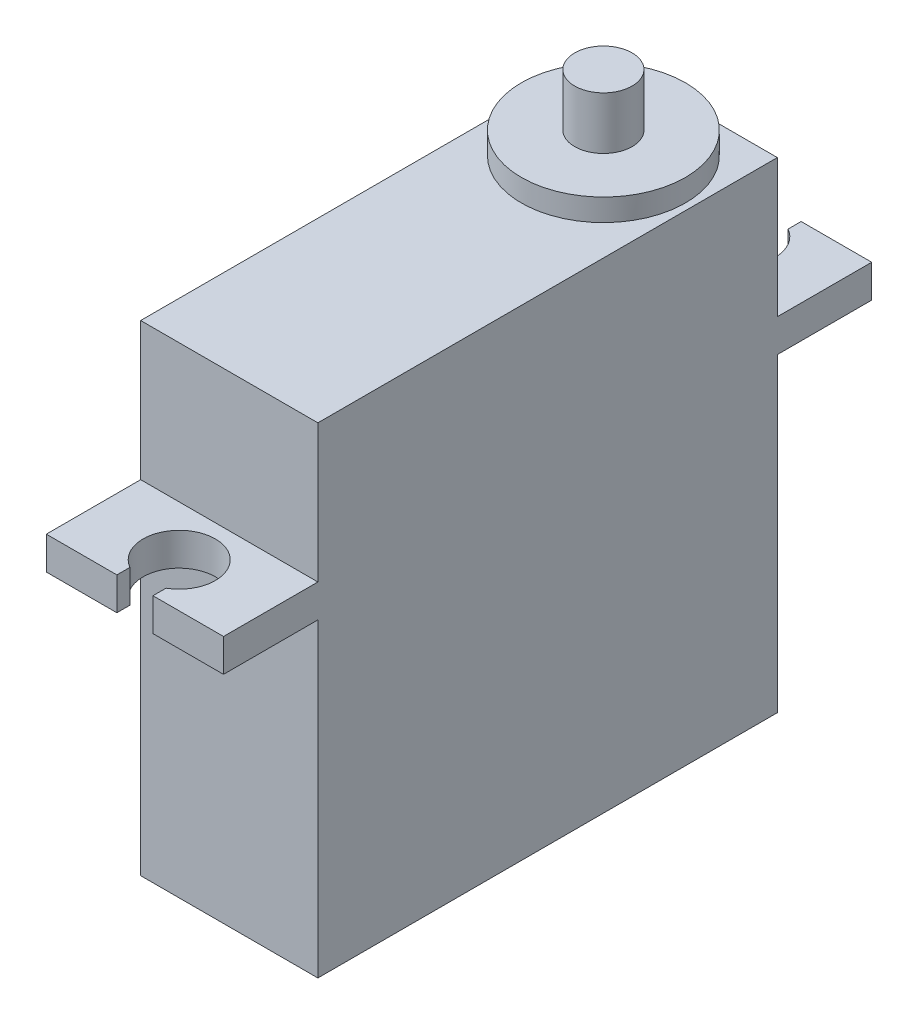
ISO-10303-21;
HEADER;
FILE_DESCRIPTION(('STEP AP214'),'2;1');
FILE_NAME('part.step','',(''),(''),'','','');
FILE_SCHEMA(('AUTOMOTIVE_DESIGN { 1 0 10303 214 1 1 1 1 }'));
ENDSEC;
DATA;
#1=APPLICATION_CONTEXT('core data for automotive mechanical design processes');
#2=APPLICATION_PROTOCOL_DEFINITION('international standard','automotive_design',2000,#1);
#3=PRODUCT_CONTEXT('',#1,'mechanical');
#4=PRODUCT('Part','Part','',(#3));
#5=PRODUCT_RELATED_PRODUCT_CATEGORY('part','',(#4));
#6=PRODUCT_DEFINITION_FORMATION('','',#4);
#7=PRODUCT_DEFINITION_CONTEXT('part definition',#1,'design');
#8=PRODUCT_DEFINITION('design','',#6,#7);
#9=PRODUCT_DEFINITION_SHAPE('','',#8);
#10=(LENGTH_UNIT() NAMED_UNIT(*) SI_UNIT(.MILLI.,.METRE.));
#11=(NAMED_UNIT(*) PLANE_ANGLE_UNIT() SI_UNIT($,.RADIAN.));
#12=(NAMED_UNIT(*) SI_UNIT($,.STERADIAN.) SOLID_ANGLE_UNIT());
#13=UNCERTAINTY_MEASURE_WITH_UNIT(LENGTH_MEASURE(1.E-05),#10,'distance_accuracy_value','');
#14=(GEOMETRIC_REPRESENTATION_CONTEXT(3) GLOBAL_UNCERTAINTY_ASSIGNED_CONTEXT((#13)) GLOBAL_UNIT_ASSIGNED_CONTEXT((#10,
#11,#12)) REPRESENTATION_CONTEXT('',''));
#15=CARTESIAN_POINT('',(0.,0.,0.));
#16=DIRECTION('',(0.,0.,1.));
#17=DIRECTION('',(1.,0.,0.));
#18=AXIS2_PLACEMENT_3D('',#15,#16,#17);
#19=CARTESIAN_POINT('',(5.4,30.65,-22.8));
#20=DIRECTION('',(0.,1.,0.));
#21=DIRECTION('',(0.,0.,1.));
#22=AXIS2_PLACEMENT_3D('',#19,#20,#21);
#23=PLANE('',#22);
#24=CARTESIAN_POINT('',(5.4,30.65,-22.8));
#25=DIRECTION('',(0.,1.,0.));
#26=DIRECTION('',(0.,0.,1.));
#27=AXIS2_PLACEMENT_3D('',#24,#25,#26);
#28=CIRCLE('',#27,5.);
#29=CARTESIAN_POINT('',(5.4,30.65,-17.8));
#30=VERTEX_POINT('',#29);
#31=EDGE_CURVE('E209',#30,#30,#28,.T.);
#32=ORIENTED_EDGE('',*,*,#31,.T.);
#33=EDGE_LOOP('',(#32));
#34=FACE_BOUND('',#33,.T.);
#35=CARTESIAN_POINT('',(5.4,30.65,-22.8));
#36=DIRECTION('',(0.,1.,0.));
#37=DIRECTION('',(0.,0.,1.));
#38=AXIS2_PLACEMENT_3D('',#35,#36,#37);
#39=CIRCLE('',#38,1.75);
#40=CARTESIAN_POINT('',(5.4,30.65,-21.05));
#41=VERTEX_POINT('',#40);
#42=EDGE_CURVE('E650',#41,#41,#39,.T.);
#43=ORIENTED_EDGE('',*,*,#42,.F.);
#44=EDGE_LOOP('',(#43));
#45=FACE_BOUND('',#44,.T.);
#46=ADVANCED_FACE('F32',(#34,#45),#23,.T.);
#47=CARTESIAN_POINT('',(0.,29.3,0.));
#48=DIRECTION('',(0.,-1.,0.));
#49=DIRECTION('',(0.,0.,-1.));
#50=AXIS2_PLACEMENT_3D('',#47,#48,#49);
#51=PLANE('',#50);
#52=DIRECTION('',(0.,0.,1.));
#53=VECTOR('',#52,1.);
#54=CARTESIAN_POINT('',(0.,29.3,0.));
#55=LINE('',#54,#53);
#56=CARTESIAN_POINT('',(0.,29.3,-28.));
#57=VERTEX_POINT('',#56);
#58=CARTESIAN_POINT('',(0.,29.3,0.));
#59=VERTEX_POINT('',#58);
#60=EDGE_CURVE('E296',#57,#59,#55,.T.);
#61=ORIENTED_EDGE('',*,*,#60,.T.);
#62=DIRECTION('',(1.,0.,0.));
#63=VECTOR('',#62,1.);
#64=CARTESIAN_POINT('',(0.,29.3,0.));
#65=LINE('',#64,#63);
#66=CARTESIAN_POINT('',(10.8,29.3,0.));
#67=VERTEX_POINT('',#66);
#68=EDGE_CURVE('E299',#59,#67,#65,.T.);
#69=ORIENTED_EDGE('',*,*,#68,.T.);
#70=DIRECTION('',(0.,0.,-1.));
#71=VECTOR('',#70,1.);
#72=CARTESIAN_POINT('',(10.8,29.3,0.));
#73=LINE('',#72,#71);
#74=CARTESIAN_POINT('',(10.8,29.3,-28.));
#75=VERTEX_POINT('',#74);
#76=EDGE_CURVE('E302',#67,#75,#73,.T.);
#77=ORIENTED_EDGE('',*,*,#76,.T.);
#78=DIRECTION('',(-1.,0.,0.));
#79=VECTOR('',#78,1.);
#80=CARTESIAN_POINT('',(0.,29.3,-28.));
#81=LINE('',#80,#79);
#82=EDGE_CURVE('E304',#75,#57,#81,.T.);
#83=ORIENTED_EDGE('',*,*,#82,.T.);
#84=EDGE_LOOP('',(#61,#69,#77,#83));
#85=FACE_BOUND('',#84,.T.);
#86=CARTESIAN_POINT('',(5.4,29.3,-22.8));
#87=DIRECTION('',(0.,-1.,0.));
#88=DIRECTION('',(0.,0.,-1.));
#89=AXIS2_PLACEMENT_3D('',#86,#87,#88);
#90=CIRCLE('',#89,5.);
#91=CARTESIAN_POINT('',(5.4,29.3,-27.8));
#92=VERTEX_POINT('',#91);
#93=EDGE_CURVE('E11',#92,#92,#90,.F.);
#94=ORIENTED_EDGE('',*,*,#93,.F.);
#95=EDGE_LOOP('',(#94));
#96=FACE_BOUND('',#95,.T.);
#97=ADVANCED_FACE('F384',(#85,#96),#51,.F.);
#98=CARTESIAN_POINT('',(0.,29.3,0.));
#99=DIRECTION('',(0.,0.,-1.));
#100=DIRECTION('',(-1.,0.,0.));
#101=AXIS2_PLACEMENT_3D('',#98,#99,#100);
#102=PLANE('',#101);
#103=DIRECTION('',(-1.,0.,0.));
#104=VECTOR('',#103,1.);
#105=CARTESIAN_POINT('',(0.,20.9,0.));
#106=LINE('',#105,#104);
#107=CARTESIAN_POINT('',(10.8,20.9,0.));
#108=VERTEX_POINT('',#107);
#109=CARTESIAN_POINT('',(0.,20.9,0.));
#110=VERTEX_POINT('',#109);
#111=EDGE_CURVE('E204',#108,#110,#106,.T.);
#112=ORIENTED_EDGE('',*,*,#111,.F.);
#113=DIRECTION('',(0.,-1.,0.));
#114=VECTOR('',#113,1.);
#115=CARTESIAN_POINT('',(10.8,29.3,0.));
#116=LINE('',#115,#114);
#117=EDGE_CURVE('E333',#67,#108,#116,.T.);
#118=ORIENTED_EDGE('',*,*,#117,.F.);
#119=ORIENTED_EDGE('',*,*,#68,.F.);
#120=DIRECTION('',(0.,-1.,0.));
#121=VECTOR('',#120,1.);
#122=CARTESIAN_POINT('',(0.,29.3,0.));
#123=LINE('',#122,#121);
#124=EDGE_CURVE('E40',#59,#110,#123,.T.);
#125=ORIENTED_EDGE('',*,*,#124,.T.);
#126=EDGE_LOOP('',(#112,#118,#119,#125));
#127=FACE_BOUND('',#126,.T.);
#128=ADVANCED_FACE('F390',(#127),#102,.F.);
#129=CARTESIAN_POINT('',(0.,29.3,-28.));
#130=DIRECTION('',(0.,0.,1.));
#131=DIRECTION('',(1.,0.,0.));
#132=AXIS2_PLACEMENT_3D('',#129,#130,#131);
#133=PLANE('',#132);
#134=DIRECTION('',(1.,0.,0.));
#135=VECTOR('',#134,1.);
#136=CARTESIAN_POINT('',(0.,20.9,-28.));
#137=LINE('',#136,#135);
#138=CARTESIAN_POINT('',(0.,20.9,-28.));
#139=VERTEX_POINT('',#138);
#140=CARTESIAN_POINT('',(10.8,20.9,-28.));
#141=VERTEX_POINT('',#140);
#142=EDGE_CURVE('E258',#139,#141,#137,.T.);
#143=ORIENTED_EDGE('',*,*,#142,.F.);
#144=DIRECTION('',(0.,-1.,0.));
#145=VECTOR('',#144,1.);
#146=CARTESIAN_POINT('',(0.,29.3,-28.));
#147=LINE('',#146,#145);
#148=EDGE_CURVE('E322',#57,#139,#147,.T.);
#149=ORIENTED_EDGE('',*,*,#148,.F.);
#150=ORIENTED_EDGE('',*,*,#82,.F.);
#151=DIRECTION('',(0.,-1.,0.));
#152=VECTOR('',#151,1.);
#153=CARTESIAN_POINT('',(10.8,29.3,-28.));
#154=LINE('',#153,#152);
#155=EDGE_CURVE('E334',#75,#141,#154,.T.);
#156=ORIENTED_EDGE('',*,*,#155,.T.);
#157=EDGE_LOOP('',(#143,#149,#150,#156));
#158=FACE_BOUND('',#157,.T.);
#159=ADVANCED_FACE('F380',(#158),#133,.F.);
#160=CARTESIAN_POINT('',(0.,29.3,0.));
#161=DIRECTION('',(1.,0.,0.));
#162=DIRECTION('',(0.,0.,-1.));
#163=AXIS2_PLACEMENT_3D('',#160,#161,#162);
#164=PLANE('',#163);
#165=DIRECTION('',(0.,0.,1.));
#166=VECTOR('',#165,1.);
#167=CARTESIAN_POINT('',(0.,0.,0.));
#168=LINE('',#167,#166);
#169=CARTESIAN_POINT('',(0.,0.,-28.));
#170=VERTEX_POINT('',#169);
#171=CARTESIAN_POINT('',(0.,0.,0.));
#172=VERTEX_POINT('',#171);
#173=EDGE_CURVE('E285',#170,#172,#168,.T.);
#174=ORIENTED_EDGE('',*,*,#173,.T.);
#175=CARTESIAN_POINT('',(0.,18.9,0.));
#176=VERTEX_POINT('',#175);
#177=EDGE_CURVE('E189',#176,#172,#123,.T.);
#178=ORIENTED_EDGE('',*,*,#177,.F.);
#179=DIRECTION('',(0.,0.,1.));
#180=VECTOR('',#179,1.);
#181=CARTESIAN_POINT('',(0.,18.9,0.));
#182=LINE('',#181,#180);
#183=CARTESIAN_POINT('',(0.,18.9,5.74999999999999));
#184=VERTEX_POINT('',#183);
#185=EDGE_CURVE('E47',#176,#184,#182,.T.);
#186=ORIENTED_EDGE('',*,*,#185,.T.);
#187=DIRECTION('',(0.,1.,0.));
#188=VECTOR('',#187,1.);
#189=CARTESIAN_POINT('',(0.,18.9,5.74999999999999));
#190=LINE('',#189,#188);
#191=CARTESIAN_POINT('',(0.,20.9,5.74999999999999));
#192=VERTEX_POINT('',#191);
#193=EDGE_CURVE('E171',#184,#192,#190,.T.);
#194=ORIENTED_EDGE('',*,*,#193,.T.);
#195=DIRECTION('',(0.,0.,1.));
#196=VECTOR('',#195,1.);
#197=CARTESIAN_POINT('',(0.,20.9,0.));
#198=LINE('',#197,#196);
#199=EDGE_CURVE('E208',#110,#192,#198,.T.);
#200=ORIENTED_EDGE('',*,*,#199,.F.);
#201=ORIENTED_EDGE('',*,*,#124,.F.);
#202=ORIENTED_EDGE('',*,*,#60,.F.);
#203=ORIENTED_EDGE('',*,*,#148,.T.);
#204=DIRECTION('',(0.,0.,1.));
#205=VECTOR('',#204,1.);
#206=CARTESIAN_POINT('',(0.,20.9,-28.));
#207=LINE('',#206,#205);
#208=CARTESIAN_POINT('',(0.,20.9,-33.75));
#209=VERTEX_POINT('',#208);
#210=EDGE_CURVE('E230',#209,#139,#207,.T.);
#211=ORIENTED_EDGE('',*,*,#210,.F.);
#212=DIRECTION('',(0.,1.,0.));
#213=VECTOR('',#212,1.);
#214=CARTESIAN_POINT('',(0.,18.9,-33.75));
#215=LINE('',#214,#213);
#216=CARTESIAN_POINT('',(0.,18.9,-33.75));
#217=VERTEX_POINT('',#216);
#218=EDGE_CURVE('E283',#217,#209,#215,.T.);
#219=ORIENTED_EDGE('',*,*,#218,.F.);
#220=DIRECTION('',(0.,0.,1.));
#221=VECTOR('',#220,1.);
#222=CARTESIAN_POINT('',(0.,18.9,-28.));
#223=LINE('',#222,#221);
#224=CARTESIAN_POINT('',(0.,18.9,-28.));
#225=VERTEX_POINT('',#224);
#226=EDGE_CURVE('E246',#217,#225,#223,.T.);
#227=ORIENTED_EDGE('',*,*,#226,.T.);
#228=EDGE_CURVE('E306',#225,#170,#147,.T.);
#229=ORIENTED_EDGE('',*,*,#228,.T.);
#230=EDGE_LOOP('',(#174,#178,#186,#194,#200,#201,#202,#203,#211,#219,#227,#229));
#231=FACE_BOUND('',#230,.T.);
#232=ADVANCED_FACE('F34',(#231),#164,.F.);
#233=CARTESIAN_POINT('',(10.8,18.9,0.));
#234=VERTEX_POINT('',#233);
#235=CARTESIAN_POINT('',(10.8,0.,0.));
#236=VERTEX_POINT('',#235);
#237=EDGE_CURVE('E331',#234,#236,#116,.T.);
#238=ORIENTED_EDGE('',*,*,#237,.F.);
#239=DIRECTION('',(-1.,0.,0.));
#240=VECTOR('',#239,1.);
#241=CARTESIAN_POINT('',(0.,18.9,0.));
#242=LINE('',#241,#240);
#243=EDGE_CURVE('E190',#234,#176,#242,.T.);
#244=ORIENTED_EDGE('',*,*,#243,.T.);
#245=ORIENTED_EDGE('',*,*,#177,.T.);
#246=DIRECTION('',(1.,0.,0.));
#247=VECTOR('',#246,1.);
#248=CARTESIAN_POINT('',(0.,0.,0.));
#249=LINE('',#248,#247);
#250=EDGE_CURVE('E308',#172,#236,#249,.T.);
#251=ORIENTED_EDGE('',*,*,#250,.T.);
#252=EDGE_LOOP('',(#238,#244,#245,#251));
#253=FACE_BOUND('',#252,.T.);
#254=ADVANCED_FACE('F402',(#253),#102,.F.);
#255=CARTESIAN_POINT('',(10.8,29.3,0.));
#256=DIRECTION('',(-1.,0.,0.));
#257=DIRECTION('',(0.,0.,1.));
#258=AXIS2_PLACEMENT_3D('',#255,#256,#257);
#259=PLANE('',#258);
#260=DIRECTION('',(0.,0.,-1.));
#261=VECTOR('',#260,1.);
#262=CARTESIAN_POINT('',(10.8,0.,0.));
#263=LINE('',#262,#261);
#264=CARTESIAN_POINT('',(10.8,0.,-28.));
#265=VERTEX_POINT('',#264);
#266=EDGE_CURVE('E311',#236,#265,#263,.T.);
#267=ORIENTED_EDGE('',*,*,#266,.T.);
#268=CARTESIAN_POINT('',(10.8,18.9,-28.));
#269=VERTEX_POINT('',#268);
#270=EDGE_CURVE('E247',#269,#265,#154,.T.);
#271=ORIENTED_EDGE('',*,*,#270,.F.);
#272=DIRECTION('',(0.,0.,-1.));
#273=VECTOR('',#272,1.);
#274=CARTESIAN_POINT('',(10.8,18.9,-28.));
#275=LINE('',#274,#273);
#276=CARTESIAN_POINT('',(10.8,18.9,-33.75));
#277=VERTEX_POINT('',#276);
#278=EDGE_CURVE('E55',#269,#277,#275,.T.);
#279=ORIENTED_EDGE('',*,*,#278,.T.);
#280=DIRECTION('',(0.,1.,0.));
#281=VECTOR('',#280,1.);
#282=CARTESIAN_POINT('',(10.8,18.9,-33.75));
#283=LINE('',#282,#281);
#284=CARTESIAN_POINT('',(10.8,20.9,-33.75));
#285=VERTEX_POINT('',#284);
#286=EDGE_CURVE('E294',#277,#285,#283,.T.);
#287=ORIENTED_EDGE('',*,*,#286,.T.);
#288=DIRECTION('',(0.,0.,-1.));
#289=VECTOR('',#288,1.);
#290=CARTESIAN_POINT('',(10.8,20.9,-28.));
#291=LINE('',#290,#289);
#292=EDGE_CURVE('E262',#141,#285,#291,.T.);
#293=ORIENTED_EDGE('',*,*,#292,.F.);
#294=ORIENTED_EDGE('',*,*,#155,.F.);
#295=ORIENTED_EDGE('',*,*,#76,.F.);
#296=ORIENTED_EDGE('',*,*,#117,.T.);
#297=DIRECTION('',(0.,0.,-1.));
#298=VECTOR('',#297,1.);
#299=CARTESIAN_POINT('',(10.8,20.9,0.));
#300=LINE('',#299,#298);
#301=CARTESIAN_POINT('',(10.8,20.9,5.75000000000001));
#302=VERTEX_POINT('',#301);
#303=EDGE_CURVE('E192',#302,#108,#300,.T.);
#304=ORIENTED_EDGE('',*,*,#303,.F.);
#305=DIRECTION('',(0.,1.,0.));
#306=VECTOR('',#305,1.);
#307=CARTESIAN_POINT('',(10.8,18.9,5.75000000000001));
#308=LINE('',#307,#306);
#309=CARTESIAN_POINT('',(10.8,18.9,5.75000000000001));
#310=VERTEX_POINT('',#309);
#311=EDGE_CURVE('E228',#310,#302,#308,.T.);
#312=ORIENTED_EDGE('',*,*,#311,.F.);
#313=DIRECTION('',(0.,0.,-1.));
#314=VECTOR('',#313,1.);
#315=CARTESIAN_POINT('',(10.8,18.9,0.));
#316=LINE('',#315,#314);
#317=EDGE_CURVE('E179',#310,#234,#316,.T.);
#318=ORIENTED_EDGE('',*,*,#317,.T.);
#319=ORIENTED_EDGE('',*,*,#237,.T.);
#320=EDGE_LOOP('',(#267,#271,#279,#287,#293,#294,#295,#296,#304,#312,#318,#319));
#321=FACE_BOUND('',#320,.T.);
#322=ADVANCED_FACE('F348',(#321),#259,.F.);
#323=ORIENTED_EDGE('',*,*,#228,.F.);
#324=DIRECTION('',(1.,0.,0.));
#325=VECTOR('',#324,1.);
#326=CARTESIAN_POINT('',(0.,18.9,-28.));
#327=LINE('',#326,#325);
#328=EDGE_CURVE('E243',#225,#269,#327,.T.);
#329=ORIENTED_EDGE('',*,*,#328,.T.);
#330=ORIENTED_EDGE('',*,*,#270,.T.);
#331=DIRECTION('',(-1.,0.,0.));
#332=VECTOR('',#331,1.);
#333=CARTESIAN_POINT('',(0.,0.,-28.));
#334=LINE('',#333,#332);
#335=EDGE_CURVE('E300',#265,#170,#334,.T.);
#336=ORIENTED_EDGE('',*,*,#335,.T.);
#337=EDGE_LOOP('',(#323,#329,#330,#336));
#338=FACE_BOUND('',#337,.T.);
#339=ADVANCED_FACE('F411',(#338),#133,.F.);
#340=CARTESIAN_POINT('',(0.,0.,0.));
#341=DIRECTION('',(0.,-1.,0.));
#342=DIRECTION('',(0.,0.,-1.));
#343=AXIS2_PLACEMENT_3D('',#340,#341,#342);
#344=PLANE('',#343);
#345=ORIENTED_EDGE('',*,*,#173,.F.);
#346=ORIENTED_EDGE('',*,*,#335,.F.);
#347=ORIENTED_EDGE('',*,*,#266,.F.);
#348=ORIENTED_EDGE('',*,*,#250,.F.);
#349=EDGE_LOOP('',(#345,#346,#347,#348));
#350=FACE_BOUND('',#349,.T.);
#351=ADVANCED_FACE('F408',(#350),#344,.T.);
#352=CARTESIAN_POINT('',(0.,18.9,-33.75));
#353=DIRECTION('',(0.,0.,-1.));
#354=DIRECTION('',(-1.,0.,0.));
#355=AXIS2_PLACEMENT_3D('',#352,#353,#354);
#356=PLANE('',#355);
#357=DIRECTION('',(-1.,0.,0.));
#358=VECTOR('',#357,1.);
#359=CARTESIAN_POINT('',(0.,20.9,-33.75));
#360=LINE('',#359,#358);
#361=CARTESIAN_POINT('',(4.3,20.9,-33.75));
#362=VERTEX_POINT('',#361);
#363=EDGE_CURVE('E255',#362,#209,#360,.T.);
#364=ORIENTED_EDGE('',*,*,#363,.F.);
#365=DIRECTION('',(0.,1.,0.));
#366=VECTOR('',#365,1.);
#367=CARTESIAN_POINT('',(4.3,18.9,-33.75));
#368=LINE('',#367,#366);
#369=CARTESIAN_POINT('',(4.3,18.9,-33.75));
#370=VERTEX_POINT('',#369);
#371=EDGE_CURVE('E286',#370,#362,#368,.T.);
#372=ORIENTED_EDGE('',*,*,#371,.F.);
#373=DIRECTION('',(-1.,0.,0.));
#374=VECTOR('',#373,1.);
#375=CARTESIAN_POINT('',(0.,18.9,-33.75));
#376=LINE('',#375,#374);
#377=EDGE_CURVE('E267',#370,#217,#376,.T.);
#378=ORIENTED_EDGE('',*,*,#377,.T.);
#379=ORIENTED_EDGE('',*,*,#218,.T.);
#380=EDGE_LOOP('',(#364,#372,#378,#379));
#381=FACE_BOUND('',#380,.T.);
#382=ADVANCED_FACE('F376',(#381),#356,.T.);
#383=CARTESIAN_POINT('',(4.3,18.9,-33.75));
#384=DIRECTION('',(1.,0.,0.));
#385=DIRECTION('',(0.,0.,-1.));
#386=AXIS2_PLACEMENT_3D('',#383,#384,#385);
#387=PLANE('',#386);
#388=DIRECTION('',(0.,0.,-1.));
#389=VECTOR('',#388,1.);
#390=CARTESIAN_POINT('',(4.3,20.9,-33.75));
#391=LINE('',#390,#389);
#392=CARTESIAN_POINT('',(4.3,20.9,-32.9552558883258));
#393=VERTEX_POINT('',#392);
#394=EDGE_CURVE('E278',#393,#362,#391,.T.);
#395=ORIENTED_EDGE('',*,*,#394,.F.);
#396=DIRECTION('',(0.,1.,0.));
#397=VECTOR('',#396,1.);
#398=CARTESIAN_POINT('',(4.3,18.9,-32.9552558883258));
#399=LINE('',#398,#397);
#400=CARTESIAN_POINT('',(4.3,18.9,-32.9552558883258));
#401=VERTEX_POINT('',#400);
#402=EDGE_CURVE('E288',#401,#393,#399,.T.);
#403=ORIENTED_EDGE('',*,*,#402,.F.);
#404=DIRECTION('',(0.,0.,-1.));
#405=VECTOR('',#404,1.);
#406=CARTESIAN_POINT('',(4.3,18.9,-33.75));
#407=LINE('',#406,#405);
#408=EDGE_CURVE('E372',#401,#370,#407,.T.);
#409=ORIENTED_EDGE('',*,*,#408,.T.);
#410=ORIENTED_EDGE('',*,*,#371,.T.);
#411=EDGE_LOOP('',(#395,#403,#409,#410));
#412=FACE_BOUND('',#411,.T.);
#413=ADVANCED_FACE('F371',(#412),#387,.T.);
#414=CARTESIAN_POINT('',(5.4,18.9,-31.05));
#415=DIRECTION('',(0.,1.,0.));
#416=DIRECTION('',(0.,0.,1.));
#417=AXIS2_PLACEMENT_3D('',#414,#415,#416);
#418=CYLINDRICAL_SURFACE('',#417,2.19999999999999);
#419=CARTESIAN_POINT('',(5.4,20.9,-31.05));
#420=DIRECTION('',(0.,-1.,0.));
#421=DIRECTION('',(0.,0.,1.));
#422=AXIS2_PLACEMENT_3D('',#419,#420,#421);
#423=CIRCLE('',#422,2.19999999999999);
#424=CARTESIAN_POINT('',(6.5,20.9,-32.9552558883258));
#425=VERTEX_POINT('',#424);
#426=EDGE_CURVE('E275',#425,#393,#423,.T.);
#427=ORIENTED_EDGE('',*,*,#426,.F.);
#428=DIRECTION('',(0.,1.,0.));
#429=VECTOR('',#428,1.);
#430=CARTESIAN_POINT('',(6.5,18.9,-32.9552558883258));
#431=LINE('',#430,#429);
#432=CARTESIAN_POINT('',(6.5,18.9,-32.9552558883258));
#433=VERTEX_POINT('',#432);
#434=EDGE_CURVE('E290',#433,#425,#431,.T.);
#435=ORIENTED_EDGE('',*,*,#434,.F.);
#436=CARTESIAN_POINT('',(5.4,18.9,-31.05));
#437=DIRECTION('',(0.,-1.,0.));
#438=DIRECTION('',(0.,0.,1.));
#439=AXIS2_PLACEMENT_3D('',#436,#437,#438);
#440=CIRCLE('',#439,2.19999999999999);
#441=EDGE_CURVE('E367',#433,#401,#440,.T.);
#442=ORIENTED_EDGE('',*,*,#441,.T.);
#443=ORIENTED_EDGE('',*,*,#402,.T.);
#444=EDGE_LOOP('',(#427,#435,#442,#443));
#445=FACE_BOUND('',#444,.T.);
#446=ADVANCED_FACE('F364',(#445),#418,.F.);
#447=CARTESIAN_POINT('',(6.5,18.9,-33.75));
#448=DIRECTION('',(-1.,0.,0.));
#449=DIRECTION('',(0.,0.,1.));
#450=AXIS2_PLACEMENT_3D('',#447,#448,#449);
#451=PLANE('',#450);
#452=DIRECTION('',(0.,0.,1.));
#453=VECTOR('',#452,1.);
#454=CARTESIAN_POINT('',(6.5,20.9,-33.75));
#455=LINE('',#454,#453);
#456=CARTESIAN_POINT('',(6.5,20.9,-33.75));
#457=VERTEX_POINT('',#456);
#458=EDGE_CURVE('E272',#457,#425,#455,.T.);
#459=ORIENTED_EDGE('',*,*,#458,.F.);
#460=DIRECTION('',(0.,1.,0.));
#461=VECTOR('',#460,1.);
#462=CARTESIAN_POINT('',(6.5,18.9,-33.75));
#463=LINE('',#462,#461);
#464=CARTESIAN_POINT('',(6.5,18.9,-33.75));
#465=VERTEX_POINT('',#464);
#466=EDGE_CURVE('E292',#465,#457,#463,.T.);
#467=ORIENTED_EDGE('',*,*,#466,.F.);
#468=DIRECTION('',(0.,0.,1.));
#469=VECTOR('',#468,1.);
#470=CARTESIAN_POINT('',(6.5,18.9,-33.75));
#471=LINE('',#470,#469);
#472=EDGE_CURVE('E414',#465,#433,#471,.T.);
#473=ORIENTED_EDGE('',*,*,#472,.T.);
#474=ORIENTED_EDGE('',*,*,#434,.T.);
#475=EDGE_LOOP('',(#459,#467,#473,#474));
#476=FACE_BOUND('',#475,.T.);
#477=ADVANCED_FACE('F359',(#476),#451,.T.);
#478=CARTESIAN_POINT('',(6.5,18.9,-33.75));
#479=DIRECTION('',(0.,0.,-1.));
#480=DIRECTION('',(-1.,0.,0.));
#481=AXIS2_PLACEMENT_3D('',#478,#479,#480);
#482=PLANE('',#481);
#483=DIRECTION('',(-1.,0.,0.));
#484=VECTOR('',#483,1.);
#485=CARTESIAN_POINT('',(6.5,20.9,-33.75));
#486=LINE('',#485,#484);
#487=EDGE_CURVE('E269',#285,#457,#486,.T.);
#488=ORIENTED_EDGE('',*,*,#487,.F.);
#489=ORIENTED_EDGE('',*,*,#286,.F.);
#490=DIRECTION('',(-1.,0.,0.));
#491=VECTOR('',#490,1.);
#492=CARTESIAN_POINT('',(6.5,18.9,-33.75));
#493=LINE('',#492,#491);
#494=EDGE_CURVE('E240',#277,#465,#493,.T.);
#495=ORIENTED_EDGE('',*,*,#494,.T.);
#496=ORIENTED_EDGE('',*,*,#466,.T.);
#497=EDGE_LOOP('',(#488,#489,#495,#496));
#498=FACE_BOUND('',#497,.T.);
#499=ADVANCED_FACE('F354',(#498),#482,.T.);
#500=CARTESIAN_POINT('',(5.4,18.9,-31.05));
#501=DIRECTION('',(0.,1.,0.));
#502=DIRECTION('',(0.,0.,1.));
#503=AXIS2_PLACEMENT_3D('',#500,#501,#502);
#504=PLANE('',#503);
#505=ORIENTED_EDGE('',*,*,#226,.F.);
#506=ORIENTED_EDGE('',*,*,#377,.F.);
#507=ORIENTED_EDGE('',*,*,#408,.F.);
#508=ORIENTED_EDGE('',*,*,#441,.F.);
#509=ORIENTED_EDGE('',*,*,#472,.F.);
#510=ORIENTED_EDGE('',*,*,#494,.F.);
#511=ORIENTED_EDGE('',*,*,#278,.F.);
#512=ORIENTED_EDGE('',*,*,#328,.F.);
#513=EDGE_LOOP('',(#505,#506,#507,#508,#509,#510,#511,#512));
#514=FACE_BOUND('',#513,.T.);
#515=ADVANCED_FACE('F413',(#514),#504,.F.);
#516=CARTESIAN_POINT('',(5.4,20.9,-31.05));
#517=DIRECTION('',(0.,1.,0.));
#518=DIRECTION('',(0.,0.,1.));
#519=AXIS2_PLACEMENT_3D('',#516,#517,#518);
#520=PLANE('',#519);
#521=ORIENTED_EDGE('',*,*,#210,.T.);
#522=ORIENTED_EDGE('',*,*,#142,.T.);
#523=ORIENTED_EDGE('',*,*,#292,.T.);
#524=ORIENTED_EDGE('',*,*,#487,.T.);
#525=ORIENTED_EDGE('',*,*,#458,.T.);
#526=ORIENTED_EDGE('',*,*,#426,.T.);
#527=ORIENTED_EDGE('',*,*,#394,.T.);
#528=ORIENTED_EDGE('',*,*,#363,.T.);
#529=EDGE_LOOP('',(#521,#522,#523,#524,#525,#526,#527,#528));
#530=FACE_BOUND('',#529,.T.);
#531=ADVANCED_FACE('F342',(#530),#520,.T.);
#532=CARTESIAN_POINT('',(6.5,18.9,5.75));
#533=DIRECTION('',(0.,0.,1.));
#534=DIRECTION('',(1.,0.,0.));
#535=AXIS2_PLACEMENT_3D('',#532,#533,#534);
#536=PLANE('',#535);
#537=DIRECTION('',(1.,0.,0.));
#538=VECTOR('',#537,1.);
#539=CARTESIAN_POINT('',(6.5,20.9,5.75));
#540=LINE('',#539,#538);
#541=CARTESIAN_POINT('',(6.5,20.9,5.75));
#542=VERTEX_POINT('',#541);
#543=EDGE_CURVE('E225',#542,#302,#540,.T.);
#544=ORIENTED_EDGE('',*,*,#543,.F.);
#545=DIRECTION('',(0.,1.,0.));
#546=VECTOR('',#545,1.);
#547=CARTESIAN_POINT('',(6.5,18.9,5.75));
#548=LINE('',#547,#546);
#549=CARTESIAN_POINT('',(6.5,18.9,5.75));
#550=VERTEX_POINT('',#549);
#551=EDGE_CURVE('E231',#550,#542,#548,.T.);
#552=ORIENTED_EDGE('',*,*,#551,.F.);
#553=DIRECTION('',(1.,0.,0.));
#554=VECTOR('',#553,1.);
#555=CARTESIAN_POINT('',(6.5,18.9,5.75));
#556=LINE('',#555,#554);
#557=EDGE_CURVE('E201',#550,#310,#556,.T.);
#558=ORIENTED_EDGE('',*,*,#557,.T.);
#559=ORIENTED_EDGE('',*,*,#311,.T.);
#560=EDGE_LOOP('',(#544,#552,#558,#559));
#561=FACE_BOUND('',#560,.T.);
#562=ADVANCED_FACE('F396',(#561),#536,.T.);
#563=CARTESIAN_POINT('',(6.5,18.9,5.75));
#564=DIRECTION('',(-1.,0.,0.));
#565=DIRECTION('',(0.,0.,1.));
#566=AXIS2_PLACEMENT_3D('',#563,#564,#565);
#567=PLANE('',#566);
#568=DIRECTION('',(0.,0.,1.));
#569=VECTOR('',#568,1.);
#570=CARTESIAN_POINT('',(6.5,20.9,5.75));
#571=LINE('',#570,#569);
#572=CARTESIAN_POINT('',(6.5,20.9,4.95525588832577));
#573=VERTEX_POINT('',#572);
#574=EDGE_CURVE('E222',#573,#542,#571,.T.);
#575=ORIENTED_EDGE('',*,*,#574,.F.);
#576=DIRECTION('',(0.,1.,0.));
#577=VECTOR('',#576,1.);
#578=CARTESIAN_POINT('',(6.5,18.9,4.95525588832577));
#579=LINE('',#578,#577);
#580=CARTESIAN_POINT('',(6.5,18.9,4.95525588832577));
#581=VERTEX_POINT('',#580);
#582=EDGE_CURVE('E233',#581,#573,#579,.T.);
#583=ORIENTED_EDGE('',*,*,#582,.F.);
#584=DIRECTION('',(0.,0.,1.));
#585=VECTOR('',#584,1.);
#586=CARTESIAN_POINT('',(6.5,18.9,5.75));
#587=LINE('',#586,#585);
#588=EDGE_CURVE('E660',#581,#550,#587,.T.);
#589=ORIENTED_EDGE('',*,*,#588,.T.);
#590=ORIENTED_EDGE('',*,*,#551,.T.);
#591=EDGE_LOOP('',(#575,#583,#589,#590));
#592=FACE_BOUND('',#591,.T.);
#593=ADVANCED_FACE('F448',(#592),#567,.T.);
#594=CARTESIAN_POINT('',(5.4,18.9,3.05));
#595=DIRECTION('',(0.,1.,0.));
#596=DIRECTION('',(0.,0.,1.));
#597=AXIS2_PLACEMENT_3D('',#594,#595,#596);
#598=CYLINDRICAL_SURFACE('',#597,2.2);
#599=CARTESIAN_POINT('',(5.4,20.9,3.05));
#600=DIRECTION('',(0.,-1.,0.));
#601=DIRECTION('',(0.,0.,-1.));
#602=AXIS2_PLACEMENT_3D('',#599,#600,#601);
#603=CIRCLE('',#602,2.2);
#604=CARTESIAN_POINT('',(4.30000000000001,20.9,4.95525588832577));
#605=VERTEX_POINT('',#604);
#606=EDGE_CURVE('E219',#605,#573,#603,.T.);
#607=ORIENTED_EDGE('',*,*,#606,.F.);
#608=DIRECTION('',(0.,1.,0.));
#609=VECTOR('',#608,1.);
#610=CARTESIAN_POINT('',(4.30000000000001,18.9,4.95525588832577));
#611=LINE('',#610,#609);
#612=CARTESIAN_POINT('',(4.30000000000001,18.9,4.95525588832577));
#613=VERTEX_POINT('',#612);
#614=EDGE_CURVE('E235',#613,#605,#611,.T.);
#615=ORIENTED_EDGE('',*,*,#614,.F.);
#616=CARTESIAN_POINT('',(5.4,18.9,3.05));
#617=DIRECTION('',(0.,-1.,0.));
#618=DIRECTION('',(0.,0.,-1.));
#619=AXIS2_PLACEMENT_3D('',#616,#617,#618);
#620=CIRCLE('',#619,2.2);
#621=EDGE_CURVE('E658',#613,#581,#620,.T.);
#622=ORIENTED_EDGE('',*,*,#621,.T.);
#623=ORIENTED_EDGE('',*,*,#582,.T.);
#624=EDGE_LOOP('',(#607,#615,#622,#623));
#625=FACE_BOUND('',#624,.T.);
#626=ADVANCED_FACE('F451',(#625),#598,.F.);
#627=CARTESIAN_POINT('',(4.30000000000001,18.9,5.75));
#628=DIRECTION('',(1.,0.,0.));
#629=DIRECTION('',(0.,0.,-1.));
#630=AXIS2_PLACEMENT_3D('',#627,#628,#629);
#631=PLANE('',#630);
#632=DIRECTION('',(0.,0.,-1.));
#633=VECTOR('',#632,1.);
#634=CARTESIAN_POINT('',(4.30000000000001,20.9,5.75));
#635=LINE('',#634,#633);
#636=CARTESIAN_POINT('',(4.30000000000001,20.9,5.75));
#637=VERTEX_POINT('',#636);
#638=EDGE_CURVE('E216',#637,#605,#635,.T.);
#639=ORIENTED_EDGE('',*,*,#638,.F.);
#640=DIRECTION('',(0.,1.,0.));
#641=VECTOR('',#640,1.);
#642=CARTESIAN_POINT('',(4.30000000000001,18.9,5.75));
#643=LINE('',#642,#641);
#644=CARTESIAN_POINT('',(4.30000000000001,18.9,5.75));
#645=VERTEX_POINT('',#644);
#646=EDGE_CURVE('E178',#645,#637,#643,.T.);
#647=ORIENTED_EDGE('',*,*,#646,.F.);
#648=DIRECTION('',(0.,0.,-1.));
#649=VECTOR('',#648,1.);
#650=CARTESIAN_POINT('',(4.30000000000001,18.9,5.75));
#651=LINE('',#650,#649);
#652=EDGE_CURVE('E185',#645,#613,#651,.T.);
#653=ORIENTED_EDGE('',*,*,#652,.T.);
#654=ORIENTED_EDGE('',*,*,#614,.T.);
#655=EDGE_LOOP('',(#639,#647,#653,#654));
#656=FACE_BOUND('',#655,.T.);
#657=ADVANCED_FACE('F455',(#656),#631,.T.);
#658=CARTESIAN_POINT('',(0.,18.9,5.74999999999999));
#659=DIRECTION('',(0.,0.,1.));
#660=DIRECTION('',(1.,0.,0.));
#661=AXIS2_PLACEMENT_3D('',#658,#659,#660);
#662=PLANE('',#661);
#663=DIRECTION('',(1.,0.,0.));
#664=VECTOR('',#663,1.);
#665=CARTESIAN_POINT('',(0.,20.9,5.74999999999999));
#666=LINE('',#665,#664);
#667=EDGE_CURVE('E175',#192,#637,#666,.T.);
#668=ORIENTED_EDGE('',*,*,#667,.F.);
#669=ORIENTED_EDGE('',*,*,#193,.F.);
#670=DIRECTION('',(1.,0.,0.));
#671=VECTOR('',#670,1.);
#672=CARTESIAN_POINT('',(0.,18.9,5.74999999999999));
#673=LINE('',#672,#671);
#674=EDGE_CURVE('E173',#184,#645,#673,.T.);
#675=ORIENTED_EDGE('',*,*,#674,.T.);
#676=ORIENTED_EDGE('',*,*,#646,.T.);
#677=EDGE_LOOP('',(#668,#669,#675,#676));
#678=FACE_BOUND('',#677,.T.);
#679=ADVANCED_FACE('F172',(#678),#662,.T.);
#680=CARTESIAN_POINT('',(5.4,18.9,3.05));
#681=DIRECTION('',(0.,-1.,0.));
#682=DIRECTION('',(0.,0.,-1.));
#683=AXIS2_PLACEMENT_3D('',#680,#681,#682);
#684=PLANE('',#683);
#685=ORIENTED_EDGE('',*,*,#243,.F.);
#686=ORIENTED_EDGE('',*,*,#317,.F.);
#687=ORIENTED_EDGE('',*,*,#557,.F.);
#688=ORIENTED_EDGE('',*,*,#588,.F.);
#689=ORIENTED_EDGE('',*,*,#621,.F.);
#690=ORIENTED_EDGE('',*,*,#652,.F.);
#691=ORIENTED_EDGE('',*,*,#674,.F.);
#692=ORIENTED_EDGE('',*,*,#185,.F.);
#693=EDGE_LOOP('',(#685,#686,#687,#688,#689,#690,#691,#692));
#694=FACE_BOUND('',#693,.T.);
#695=ADVANCED_FACE('F182',(#694),#684,.T.);
#696=CARTESIAN_POINT('',(5.4,20.9,3.05));
#697=DIRECTION('',(0.,-1.,0.));
#698=DIRECTION('',(0.,0.,-1.));
#699=AXIS2_PLACEMENT_3D('',#696,#697,#698);
#700=PLANE('',#699);
#701=ORIENTED_EDGE('',*,*,#111,.T.);
#702=ORIENTED_EDGE('',*,*,#199,.T.);
#703=ORIENTED_EDGE('',*,*,#667,.T.);
#704=ORIENTED_EDGE('',*,*,#638,.T.);
#705=ORIENTED_EDGE('',*,*,#606,.T.);
#706=ORIENTED_EDGE('',*,*,#574,.T.);
#707=ORIENTED_EDGE('',*,*,#543,.T.);
#708=ORIENTED_EDGE('',*,*,#303,.T.);
#709=EDGE_LOOP('',(#701,#702,#703,#704,#705,#706,#707,#708));
#710=FACE_BOUND('',#709,.T.);
#711=ADVANCED_FACE('F392',(#710),#700,.F.);
#712=CARTESIAN_POINT('',(5.4,30.65,-22.8));
#713=DIRECTION('',(0.,-1.,0.));
#714=DIRECTION('',(0.,0.,-1.));
#715=AXIS2_PLACEMENT_3D('',#712,#713,#714);
#716=CYLINDRICAL_SURFACE('',#715,5.);
#717=ORIENTED_EDGE('',*,*,#31,.F.);
#718=EDGE_LOOP('',(#717));
#719=FACE_BOUND('',#718,.T.);
#720=ORIENTED_EDGE('',*,*,#93,.T.);
#721=EDGE_LOOP('',(#720));
#722=FACE_BOUND('',#721,.T.);
#723=ADVANCED_FACE('F438',(#719,#722),#716,.T.);
#724=CARTESIAN_POINT('',(5.4,33.85,-22.8));
#725=DIRECTION('',(0.,-1.,0.));
#726=DIRECTION('',(0.,0.,-1.));
#727=AXIS2_PLACEMENT_3D('',#724,#725,#726);
#728=CYLINDRICAL_SURFACE('',#727,1.75);
#729=CARTESIAN_POINT('',(5.4,33.85,-22.8));
#730=DIRECTION('',(0.,1.,0.));
#731=DIRECTION('',(0.,0.,1.));
#732=AXIS2_PLACEMENT_3D('',#729,#730,#731);
#733=CIRCLE('',#732,1.75);
#734=CARTESIAN_POINT('',(5.4,33.85,-21.05));
#735=VERTEX_POINT('',#734);
#736=EDGE_CURVE('E649',#735,#735,#733,.T.);
#737=ORIENTED_EDGE('',*,*,#736,.F.);
#738=EDGE_LOOP('',(#737));
#739=FACE_BOUND('',#738,.T.);
#740=ORIENTED_EDGE('',*,*,#42,.T.);
#741=EDGE_LOOP('',(#740));
#742=FACE_BOUND('',#741,.T.);
#743=ADVANCED_FACE('F436',(#739,#742),#728,.T.);
#744=CARTESIAN_POINT('',(5.4,33.85,-22.8));
#745=DIRECTION('',(0.,1.,0.));
#746=DIRECTION('',(0.,0.,1.));
#747=AXIS2_PLACEMENT_3D('',#744,#745,#746);
#748=PLANE('',#747);
#749=ORIENTED_EDGE('',*,*,#736,.T.);
#750=EDGE_LOOP('',(#749));
#751=FACE_BOUND('',#750,.T.);
#752=ADVANCED_FACE('F483',(#751),#748,.T.);
#753=CLOSED_SHELL('',(#46,#97,#128,#159,#232,#254,#322,#339,#351,#382,#413,#446,#477,#499,#515,
#531,#562,#593,#626,#657,#679,#695,#711,#723,#743,#752));
#754=MANIFOLD_SOLID_BREP('B2',#753);
#755=ADVANCED_BREP_SHAPE_REPRESENTATION('',(#18,#754),#14);
#756=SHAPE_DEFINITION_REPRESENTATION(#9,#755);
ENDSEC;
END-ISO-10303-21;
